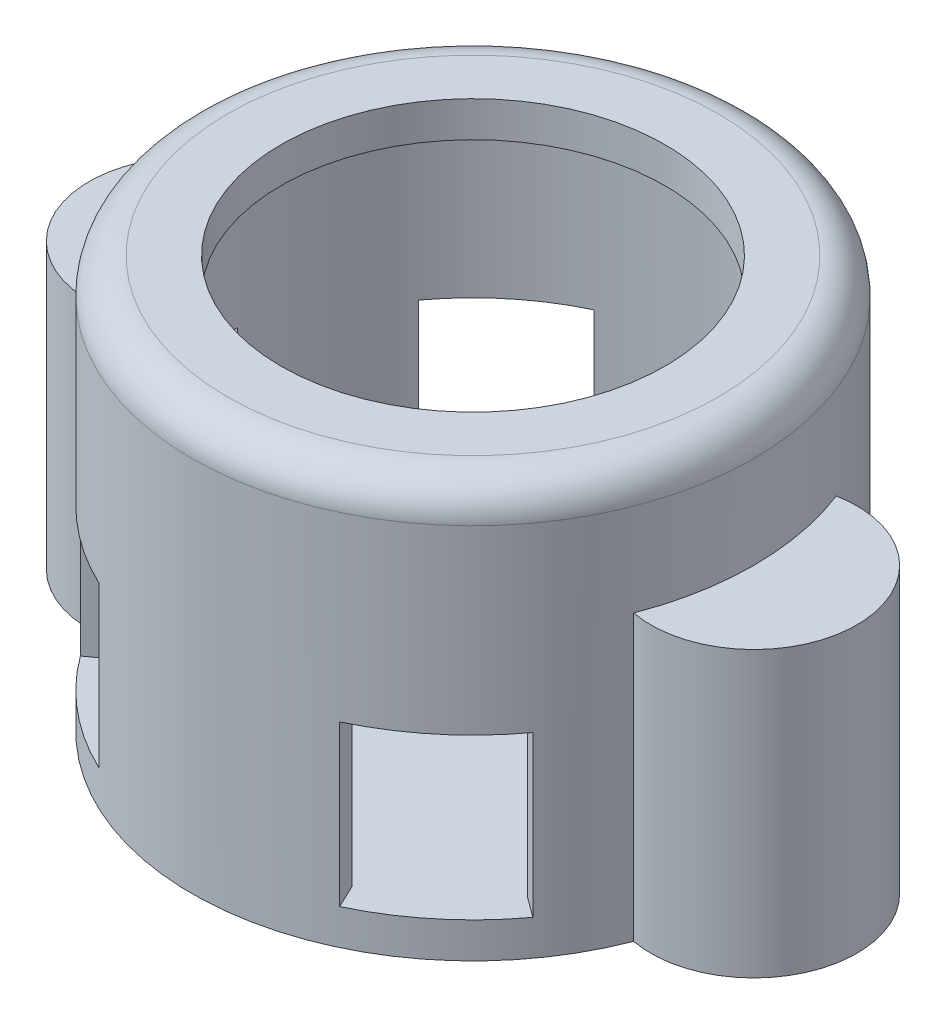
ISO-10303-21;
HEADER;
FILE_DESCRIPTION(('STEP AP214'),'2;1');
FILE_NAME('part.step','',(''),(''),'','','');
FILE_SCHEMA(('AUTOMOTIVE_DESIGN { 1 0 10303 214 1 1 1 1 }'));
ENDSEC;
DATA;
#1=APPLICATION_CONTEXT('core data for automotive mechanical design processes');
#2=APPLICATION_PROTOCOL_DEFINITION('international standard','automotive_design',2000,#1);
#3=PRODUCT_CONTEXT('',#1,'mechanical');
#4=PRODUCT('Part','Part','',(#3));
#5=PRODUCT_RELATED_PRODUCT_CATEGORY('part','',(#4));
#6=PRODUCT_DEFINITION_FORMATION('','',#4);
#7=PRODUCT_DEFINITION_CONTEXT('part definition',#1,'design');
#8=PRODUCT_DEFINITION('design','',#6,#7);
#9=PRODUCT_DEFINITION_SHAPE('','',#8);
#10=(LENGTH_UNIT() NAMED_UNIT(*) SI_UNIT(.MILLI.,.METRE.));
#11=(NAMED_UNIT(*) PLANE_ANGLE_UNIT() SI_UNIT($,.RADIAN.));
#12=(NAMED_UNIT(*) SI_UNIT($,.STERADIAN.) SOLID_ANGLE_UNIT());
#13=UNCERTAINTY_MEASURE_WITH_UNIT(LENGTH_MEASURE(1.E-05),#10,'distance_accuracy_value','');
#14=(GEOMETRIC_REPRESENTATION_CONTEXT(3) GLOBAL_UNCERTAINTY_ASSIGNED_CONTEXT((#13)) GLOBAL_UNIT_ASSIGNED_CONTEXT((#10,
#11,#12)) REPRESENTATION_CONTEXT('',''));
#15=CARTESIAN_POINT('',(0.,0.,0.));
#16=DIRECTION('',(0.,0.,1.));
#17=DIRECTION('',(1.,0.,0.));
#18=AXIS2_PLACEMENT_3D('',#15,#16,#17);
#19=CARTESIAN_POINT('',(0.,11.6,0.));
#20=DIRECTION('',(0.,-1.,0.));
#21=DIRECTION('',(0.,0.,-1.));
#22=AXIS2_PLACEMENT_3D('',#19,#20,#21);
#23=CYLINDRICAL_SURFACE('',#22,7.9);
#24=CARTESIAN_POINT('',(0.,5.5,0.));
#25=DIRECTION('',(0.,-1.,0.));
#26=DIRECTION('',(-0.805612655828306,0.,0.592442612215955));
#27=AXIS2_PLACEMENT_3D('',#24,#25,#26);
#28=CIRCLE('',#27,7.9);
#29=CARTESIAN_POINT('',(-3.38662025263003,5.5,7.13728262467419));
#30=VERTEX_POINT('',#29);
#31=CARTESIAN_POINT('',(-6.36433998104362,5.5,4.68029663650604));
#32=VERTEX_POINT('',#31);
#33=EDGE_CURVE('E497',#30,#32,#28,.T.);
#34=ORIENTED_EDGE('',*,*,#33,.F.);
#35=DIRECTION('',(0.,1.,0.));
#36=VECTOR('',#35,1.);
#37=CARTESIAN_POINT('',(-3.38662025263003,0.999999999999997,7.13728262467419));
#38=LINE('',#37,#36);
#39=CARTESIAN_POINT('',(-3.38662025263003,0.999999999999997,7.13728262467419));
#40=VERTEX_POINT('',#39);
#41=EDGE_CURVE('E508',#40,#30,#38,.T.);
#42=ORIENTED_EDGE('',*,*,#41,.F.);
#43=CARTESIAN_POINT('',(0.,0.999999999999999,0.));
#44=DIRECTION('',(0.,-1.,0.));
#45=DIRECTION('',(-0.805612655828306,0.,0.592442612215955));
#46=AXIS2_PLACEMENT_3D('',#43,#44,#45);
#47=CIRCLE('',#46,7.9);
#48=CARTESIAN_POINT('',(-6.36433998104362,0.999999999999999,4.68029663650604));
#49=VERTEX_POINT('',#48);
#50=EDGE_CURVE('E504',#40,#49,#47,.T.);
#51=ORIENTED_EDGE('',*,*,#50,.T.);
#52=DIRECTION('',(0.,-1.,0.));
#53=VECTOR('',#52,1.);
#54=CARTESIAN_POINT('',(-6.36433998104362,5.5,4.68029663650604));
#55=LINE('',#54,#53);
#56=EDGE_CURVE('E477',#32,#49,#55,.T.);
#57=ORIENTED_EDGE('',*,*,#56,.F.);
#58=EDGE_LOOP('',(#34,#42,#51,#57));
#59=FACE_BOUND('',#58,.T.);
#60=CARTESIAN_POINT('',(0.,0.999999999999999,0.));
#61=DIRECTION('',(0.,-1.,0.));
#62=DIRECTION('',(0.428686107927853,0.,0.903453496794201));
#63=AXIS2_PLACEMENT_3D('',#60,#61,#62);
#64=CIRCLE('',#63,7.9);
#65=CARTESIAN_POINT('',(6.36433998104361,0.999999999999999,4.68029663650605));
#66=VERTEX_POINT('',#65);
#67=CARTESIAN_POINT('',(3.38662025263004,0.999999999999997,7.13728262467419));
#68=VERTEX_POINT('',#67);
#69=EDGE_CURVE('E474',#66,#68,#64,.T.);
#70=ORIENTED_EDGE('',*,*,#69,.T.);
#71=DIRECTION('',(0.,-1.,0.));
#72=VECTOR('',#71,1.);
#73=CARTESIAN_POINT('',(3.38662025263004,5.5,7.13728262467419));
#74=LINE('',#73,#72);
#75=CARTESIAN_POINT('',(3.38662025263004,5.5,7.13728262467419));
#76=VERTEX_POINT('',#75);
#77=EDGE_CURVE('E487',#76,#68,#74,.T.);
#78=ORIENTED_EDGE('',*,*,#77,.F.);
#79=CARTESIAN_POINT('',(0.,5.5,0.));
#80=DIRECTION('',(0.,-1.,0.));
#81=DIRECTION('',(0.428686107927853,0.,0.903453496794201));
#82=AXIS2_PLACEMENT_3D('',#79,#80,#81);
#83=CIRCLE('',#82,7.9);
#84=CARTESIAN_POINT('',(6.36433998104361,5.5,4.68029663650605));
#85=VERTEX_POINT('',#84);
#86=EDGE_CURVE('E483',#85,#76,#83,.T.);
#87=ORIENTED_EDGE('',*,*,#86,.F.);
#88=DIRECTION('',(0.,1.,0.));
#89=VECTOR('',#88,1.);
#90=CARTESIAN_POINT('',(6.36433998104361,0.999999999999997,4.68029663650605));
#91=LINE('',#90,#89);
#92=EDGE_CURVE('E365',#66,#85,#91,.T.);
#93=ORIENTED_EDGE('',*,*,#92,.F.);
#94=EDGE_LOOP('',(#70,#78,#87,#93));
#95=FACE_BOUND('',#94,.T.);
#96=CARTESIAN_POINT('',(0.,5.5,0.));
#97=DIRECTION('',(0.,-1.,0.));
#98=DIRECTION('',(0.805612655828305,0.,-0.592442612215955));
#99=AXIS2_PLACEMENT_3D('',#96,#97,#98);
#100=CIRCLE('',#99,7.9);
#101=CARTESIAN_POINT('',(3.38662025263003,5.5,-7.13728262467419));
#102=VERTEX_POINT('',#101);
#103=CARTESIAN_POINT('',(6.36433998104361,5.5,-4.68029663650605));
#104=VERTEX_POINT('',#103);
#105=EDGE_CURVE('E452',#102,#104,#100,.T.);
#106=ORIENTED_EDGE('',*,*,#105,.F.);
#107=DIRECTION('',(0.,1.,0.));
#108=VECTOR('',#107,1.);
#109=CARTESIAN_POINT('',(3.38662025263004,1.,-7.13728262467419));
#110=LINE('',#109,#108);
#111=CARTESIAN_POINT('',(3.38662025263004,1.,-7.13728262467419));
#112=VERTEX_POINT('',#111);
#113=EDGE_CURVE('E463',#112,#102,#110,.T.);
#114=ORIENTED_EDGE('',*,*,#113,.F.);
#115=CARTESIAN_POINT('',(0.,1.,0.));
#116=DIRECTION('',(0.,-1.,0.));
#117=DIRECTION('',(0.805612655828305,0.,-0.592442612215955));
#118=AXIS2_PLACEMENT_3D('',#115,#116,#117);
#119=CIRCLE('',#118,7.9);
#120=CARTESIAN_POINT('',(6.36433998104361,1.,-4.68029663650605));
#121=VERTEX_POINT('',#120);
#122=EDGE_CURVE('E459',#112,#121,#119,.T.);
#123=ORIENTED_EDGE('',*,*,#122,.T.);
#124=DIRECTION('',(0.,-1.,0.));
#125=VECTOR('',#124,1.);
#126=CARTESIAN_POINT('',(6.36433998104361,5.5,-4.68029663650605));
#127=LINE('',#126,#125);
#128=EDGE_CURVE('E430',#104,#121,#127,.T.);
#129=ORIENTED_EDGE('',*,*,#128,.F.);
#130=EDGE_LOOP('',(#106,#114,#123,#129));
#131=FACE_BOUND('',#130,.T.);
#132=CARTESIAN_POINT('',(0.,1.,0.));
#133=DIRECTION('',(0.,-1.,0.));
#134=DIRECTION('',(-0.428686107927852,0.,-0.903453496794201));
#135=AXIS2_PLACEMENT_3D('',#132,#133,#134);
#136=CIRCLE('',#135,7.9);
#137=CARTESIAN_POINT('',(-6.36433998104361,1.,-4.68029663650605));
#138=VERTEX_POINT('',#137);
#139=CARTESIAN_POINT('',(-3.38662025263003,1.,-7.13728262467419));
#140=VERTEX_POINT('',#139);
#141=EDGE_CURVE('E427',#138,#140,#136,.T.);
#142=ORIENTED_EDGE('',*,*,#141,.T.);
#143=DIRECTION('',(0.,-1.,0.));
#144=VECTOR('',#143,1.);
#145=CARTESIAN_POINT('',(-3.38662025263003,5.5,-7.13728262467419));
#146=LINE('',#145,#144);
#147=CARTESIAN_POINT('',(-3.38662025263003,5.5,-7.13728262467419));
#148=VERTEX_POINT('',#147);
#149=EDGE_CURVE('E442',#148,#140,#146,.T.);
#150=ORIENTED_EDGE('',*,*,#149,.F.);
#151=CARTESIAN_POINT('',(0.,5.5,0.));
#152=DIRECTION('',(0.,-1.,0.));
#153=DIRECTION('',(-0.428686107927852,0.,-0.903453496794201));
#154=AXIS2_PLACEMENT_3D('',#151,#152,#153);
#155=CIRCLE('',#154,7.9);
#156=CARTESIAN_POINT('',(-6.36433998104361,5.5,-4.68029663650605));
#157=VERTEX_POINT('',#156);
#158=EDGE_CURVE('E437',#157,#148,#155,.T.);
#159=ORIENTED_EDGE('',*,*,#158,.F.);
#160=DIRECTION('',(0.,1.,0.));
#161=VECTOR('',#160,1.);
#162=CARTESIAN_POINT('',(-6.36433998104361,1.,-4.68029663650605));
#163=LINE('',#162,#161);
#164=EDGE_CURVE('E434',#138,#157,#163,.T.);
#165=ORIENTED_EDGE('',*,*,#164,.F.);
#166=EDGE_LOOP('',(#142,#150,#159,#165));
#167=FACE_BOUND('',#166,.T.);
#168=CARTESIAN_POINT('',(0.,10.6,0.));
#169=DIRECTION('',(0.,1.,0.));
#170=DIRECTION('',(0.,0.,1.));
#171=AXIS2_PLACEMENT_3D('',#168,#169,#170);
#172=CIRCLE('',#171,7.9);
#173=CARTESIAN_POINT('',(0.,10.6,7.9));
#174=VERTEX_POINT('',#173);
#175=EDGE_CURVE('E929',#174,#174,#172,.F.);
#176=ORIENTED_EDGE('',*,*,#175,.T.);
#177=EDGE_LOOP('',(#176));
#178=FACE_BOUND('',#177,.T.);
#179=DIRECTION('',(0.,-1.,0.));
#180=VECTOR('',#179,1.);
#181=CARTESIAN_POINT('',(7.36772151898734,8.,2.85073317212447));
#182=LINE('',#181,#180);
#183=CARTESIAN_POINT('',(7.36772151898734,8.,2.85073317212447));
#184=VERTEX_POINT('',#183);
#185=CARTESIAN_POINT('',(7.36772151898734,0.,2.85073317212447));
#186=VERTEX_POINT('',#185);
#187=EDGE_CURVE('E403',#184,#186,#182,.T.);
#188=ORIENTED_EDGE('',*,*,#187,.F.);
#189=CARTESIAN_POINT('',(0.,8.,0.));
#190=DIRECTION('',(0.,1.,0.));
#191=DIRECTION('',(0.,0.,1.));
#192=AXIS2_PLACEMENT_3D('',#189,#190,#191);
#193=CIRCLE('',#192,7.9);
#194=CARTESIAN_POINT('',(7.36772151898734,8.,-2.85073317212447));
#195=VERTEX_POINT('',#194);
#196=EDGE_CURVE('E405',#184,#195,#193,.T.);
#197=ORIENTED_EDGE('',*,*,#196,.T.);
#198=DIRECTION('',(0.,-1.,0.));
#199=VECTOR('',#198,1.);
#200=CARTESIAN_POINT('',(7.36772151898734,8.,-2.85073317212447));
#201=LINE('',#200,#199);
#202=CARTESIAN_POINT('',(7.36772151898734,0.,-2.85073317212447));
#203=VERTEX_POINT('',#202);
#204=EDGE_CURVE('E397',#195,#203,#201,.T.);
#205=ORIENTED_EDGE('',*,*,#204,.T.);
#206=CARTESIAN_POINT('',(0.,0.,0.));
#207=DIRECTION('',(0.,1.,0.));
#208=DIRECTION('',(0.,0.,1.));
#209=AXIS2_PLACEMENT_3D('',#206,#207,#208);
#210=CIRCLE('',#209,7.9);
#211=CARTESIAN_POINT('',(-7.36772151898734,0.,-2.85073317212447));
#212=VERTEX_POINT('',#211);
#213=EDGE_CURVE('E382',#203,#212,#210,.T.);
#214=ORIENTED_EDGE('',*,*,#213,.T.);
#215=DIRECTION('',(0.,-1.,0.));
#216=VECTOR('',#215,1.);
#217=CARTESIAN_POINT('',(-7.36772151898734,8.,-2.85073317212447));
#218=LINE('',#217,#216);
#219=CARTESIAN_POINT('',(-7.36772151898734,8.,-2.85073317212447));
#220=VERTEX_POINT('',#219);
#221=EDGE_CURVE('E386',#220,#212,#218,.T.);
#222=ORIENTED_EDGE('',*,*,#221,.F.);
#223=CARTESIAN_POINT('',(0.,8.,0.));
#224=DIRECTION('',(0.,1.,0.));
#225=DIRECTION('',(0.,0.,1.));
#226=AXIS2_PLACEMENT_3D('',#223,#224,#225);
#227=CIRCLE('',#226,7.9);
#228=CARTESIAN_POINT('',(-7.36772151898734,8.,2.85073317212447));
#229=VERTEX_POINT('',#228);
#230=EDGE_CURVE('E396',#220,#229,#227,.T.);
#231=ORIENTED_EDGE('',*,*,#230,.T.);
#232=DIRECTION('',(0.,-1.,0.));
#233=VECTOR('',#232,1.);
#234=CARTESIAN_POINT('',(-7.36772151898734,8.,2.85073317212447));
#235=LINE('',#234,#233);
#236=CARTESIAN_POINT('',(-7.36772151898734,0.,2.85073317212447));
#237=VERTEX_POINT('',#236);
#238=EDGE_CURVE('E390',#229,#237,#235,.T.);
#239=ORIENTED_EDGE('',*,*,#238,.T.);
#240=EDGE_CURVE('E379',#237,#186,#210,.T.);
#241=ORIENTED_EDGE('',*,*,#240,.T.);
#242=EDGE_LOOP('',(#188,#197,#205,#214,#222,#231,#239,#241));
#243=FACE_BOUND('',#242,.T.);
#244=ADVANCED_FACE('F164',(#59,#95,#131,#167,#178,#243),#23,.T.);
#245=CARTESIAN_POINT('',(0.,11.6,0.));
#246=DIRECTION('',(0.,1.,0.));
#247=DIRECTION('',(0.,0.,1.));
#248=AXIS2_PLACEMENT_3D('',#245,#246,#247);
#249=PLANE('',#248);
#250=CARTESIAN_POINT('',(0.,11.6,0.));
#251=DIRECTION('',(0.,1.,0.));
#252=DIRECTION('',(0.,0.,1.));
#253=AXIS2_PLACEMENT_3D('',#250,#251,#252);
#254=CIRCLE('',#253,6.9);
#255=CARTESIAN_POINT('',(0.,11.6,6.9));
#256=VERTEX_POINT('',#255);
#257=EDGE_CURVE('E931',#256,#256,#254,.T.);
#258=ORIENTED_EDGE('',*,*,#257,.T.);
#259=EDGE_LOOP('',(#258));
#260=FACE_BOUND('',#259,.T.);
#261=CARTESIAN_POINT('',(0.,11.6,0.));
#262=DIRECTION('',(0.,1.,0.));
#263=DIRECTION('',(0.,0.,1.));
#264=AXIS2_PLACEMENT_3D('',#261,#262,#263);
#265=CIRCLE('',#264,5.4);
#266=CARTESIAN_POINT('',(0.,11.6,5.4));
#267=VERTEX_POINT('',#266);
#268=EDGE_CURVE('E417',#267,#267,#265,.T.);
#269=ORIENTED_EDGE('',*,*,#268,.F.);
#270=EDGE_LOOP('',(#269));
#271=FACE_BOUND('',#270,.T.);
#272=ADVANCED_FACE('F527',(#260,#271),#249,.T.);
#273=CARTESIAN_POINT('',(0.,0.,0.));
#274=DIRECTION('',(0.,1.,0.));
#275=DIRECTION('',(0.,0.,1.));
#276=AXIS2_PLACEMENT_3D('',#273,#274,#275);
#277=PLANE('',#276);
#278=CARTESIAN_POINT('',(-8.,0.,0.));
#279=DIRECTION('',(0.,-1.,0.));
#280=DIRECTION('',(0.,0.,-1.));
#281=AXIS2_PLACEMENT_3D('',#278,#279,#280);
#282=CIRCLE('',#281,1.);
#283=CARTESIAN_POINT('',(-8.,0.,-1.));
#284=VERTEX_POINT('',#283);
#285=EDGE_CURVE('E518',#284,#284,#282,.T.);
#286=ORIENTED_EDGE('',*,*,#285,.F.);
#287=EDGE_LOOP('',(#286));
#288=FACE_BOUND('',#287,.T.);
#289=CARTESIAN_POINT('',(8.,0.,0.));
#290=DIRECTION('',(0.,-1.,0.));
#291=DIRECTION('',(0.,0.,-1.));
#292=AXIS2_PLACEMENT_3D('',#289,#290,#291);
#293=CIRCLE('',#292,1.);
#294=CARTESIAN_POINT('',(8.,0.,-1.));
#295=VERTEX_POINT('',#294);
#296=EDGE_CURVE('E335',#295,#295,#293,.T.);
#297=ORIENTED_EDGE('',*,*,#296,.F.);
#298=EDGE_LOOP('',(#297));
#299=FACE_BOUND('',#298,.T.);
#300=ORIENTED_EDGE('',*,*,#240,.F.);
#301=CARTESIAN_POINT('',(-7.9,0.,0.));
#302=DIRECTION('',(0.,1.,0.));
#303=DIRECTION('',(0.,0.,1.));
#304=AXIS2_PLACEMENT_3D('',#301,#302,#303);
#305=CIRCLE('',#304,2.9);
#306=EDGE_CURVE('E393',#212,#237,#305,.T.);
#307=ORIENTED_EDGE('',*,*,#306,.F.);
#308=ORIENTED_EDGE('',*,*,#213,.F.);
#309=CARTESIAN_POINT('',(7.9,0.,0.));
#310=DIRECTION('',(0.,1.,0.));
#311=DIRECTION('',(0.,0.,1.));
#312=AXIS2_PLACEMENT_3D('',#309,#310,#311);
#313=CIRCLE('',#312,2.9);
#314=EDGE_CURVE('E406',#186,#203,#313,.T.);
#315=ORIENTED_EDGE('',*,*,#314,.F.);
#316=EDGE_LOOP('',(#300,#307,#308,#315));
#317=FACE_BOUND('',#316,.T.);
#318=ADVANCED_FACE('F523',(#288,#299,#317),#277,.F.);
#319=CARTESIAN_POINT('',(-7.9,8.,0.));
#320=DIRECTION('',(0.,-1.,0.));
#321=DIRECTION('',(0.,0.,-1.));
#322=AXIS2_PLACEMENT_3D('',#319,#320,#321);
#323=CYLINDRICAL_SURFACE('',#322,2.9);
#324=ORIENTED_EDGE('',*,*,#306,.T.);
#325=ORIENTED_EDGE('',*,*,#238,.F.);
#326=CARTESIAN_POINT('',(-7.9,8.,0.));
#327=DIRECTION('',(0.,1.,0.));
#328=DIRECTION('',(0.,0.,1.));
#329=AXIS2_PLACEMENT_3D('',#326,#327,#328);
#330=CIRCLE('',#329,2.9);
#331=EDGE_CURVE('E392',#220,#229,#330,.T.);
#332=ORIENTED_EDGE('',*,*,#331,.F.);
#333=ORIENTED_EDGE('',*,*,#221,.T.);
#334=EDGE_LOOP('',(#324,#325,#332,#333));
#335=FACE_BOUND('',#334,.T.);
#336=ADVANCED_FACE('F526',(#335),#323,.T.);
#337=CARTESIAN_POINT('',(0.,8.,0.));
#338=DIRECTION('',(0.,1.,0.));
#339=DIRECTION('',(0.,0.,1.));
#340=AXIS2_PLACEMENT_3D('',#337,#338,#339);
#341=PLANE('',#340);
#342=ORIENTED_EDGE('',*,*,#230,.F.);
#343=ORIENTED_EDGE('',*,*,#331,.T.);
#344=EDGE_LOOP('',(#342,#343));
#345=FACE_BOUND('',#344,.T.);
#346=ADVANCED_FACE('F554',(#345),#341,.T.);
#347=CARTESIAN_POINT('',(7.9,8.,0.));
#348=DIRECTION('',(0.,-1.,0.));
#349=DIRECTION('',(0.,0.,-1.));
#350=AXIS2_PLACEMENT_3D('',#347,#348,#349);
#351=CYLINDRICAL_SURFACE('',#350,2.9);
#352=ORIENTED_EDGE('',*,*,#314,.T.);
#353=ORIENTED_EDGE('',*,*,#204,.F.);
#354=CARTESIAN_POINT('',(7.9,8.,0.));
#355=DIRECTION('',(0.,1.,0.));
#356=DIRECTION('',(0.,0.,1.));
#357=AXIS2_PLACEMENT_3D('',#354,#355,#356);
#358=CIRCLE('',#357,2.9);
#359=EDGE_CURVE('E409',#184,#195,#358,.T.);
#360=ORIENTED_EDGE('',*,*,#359,.F.);
#361=ORIENTED_EDGE('',*,*,#187,.T.);
#362=EDGE_LOOP('',(#352,#353,#360,#361));
#363=FACE_BOUND('',#362,.T.);
#364=ADVANCED_FACE('F541',(#363),#351,.T.);
#365=CARTESIAN_POINT('',(0.,8.,0.));
#366=DIRECTION('',(0.,1.,0.));
#367=DIRECTION('',(0.,0.,1.));
#368=AXIS2_PLACEMENT_3D('',#365,#366,#367);
#369=PLANE('',#368);
#370=ORIENTED_EDGE('',*,*,#359,.T.);
#371=ORIENTED_EDGE('',*,*,#196,.F.);
#372=EDGE_LOOP('',(#370,#371));
#373=FACE_BOUND('',#372,.T.);
#374=ADVANCED_FACE('F543',(#373),#369,.T.);
#375=CARTESIAN_POINT('',(0.,10.6,0.));
#376=DIRECTION('',(0.,1.,0.));
#377=DIRECTION('',(0.,0.,1.));
#378=AXIS2_PLACEMENT_3D('',#375,#376,#377);
#379=PLANE('',#378);
#380=CARTESIAN_POINT('',(0.,10.6,0.));
#381=DIRECTION('',(0.,1.,0.));
#382=DIRECTION('',(0.,0.,1.));
#383=AXIS2_PLACEMENT_3D('',#380,#381,#382);
#384=CIRCLE('',#383,5.4);
#385=CARTESIAN_POINT('',(0.,10.6,5.4));
#386=VERTEX_POINT('',#385);
#387=EDGE_CURVE('E416',#386,#386,#384,.T.);
#388=ORIENTED_EDGE('',*,*,#387,.T.);
#389=EDGE_LOOP('',(#388));
#390=FACE_BOUND('',#389,.T.);
#391=CARTESIAN_POINT('',(0.,10.6,0.));
#392=DIRECTION('',(0.,1.,0.));
#393=DIRECTION('',(0.,0.,1.));
#394=AXIS2_PLACEMENT_3D('',#391,#392,#393);
#395=CIRCLE('',#394,7.16746803387519);
#396=CARTESIAN_POINT('',(0.,10.6,7.16746803387519));
#397=VERTEX_POINT('',#396);
#398=EDGE_CURVE('E410',#397,#397,#395,.T.);
#399=ORIENTED_EDGE('',*,*,#398,.F.);
#400=EDGE_LOOP('',(#399));
#401=FACE_BOUND('',#400,.T.);
#402=ADVANCED_FACE('F545',(#390,#401),#379,.F.);
#403=CARTESIAN_POINT('',(0.,10.6,0.));
#404=DIRECTION('',(0.,1.,0.));
#405=DIRECTION('',(0.,0.,1.));
#406=AXIS2_PLACEMENT_3D('',#403,#404,#405);
#407=CYLINDRICAL_SURFACE('',#406,5.4);
#408=ORIENTED_EDGE('',*,*,#387,.F.);
#409=EDGE_LOOP('',(#408));
#410=FACE_BOUND('',#409,.T.);
#411=ORIENTED_EDGE('',*,*,#268,.T.);
#412=EDGE_LOOP('',(#411));
#413=FACE_BOUND('',#412,.T.);
#414=ADVANCED_FACE('F551',(#410,#413),#407,.F.);
#415=CARTESIAN_POINT('',(0.,1.,0.));
#416=DIRECTION('',(0.,1.,0.));
#417=DIRECTION('',(0.,0.,1.));
#418=AXIS2_PLACEMENT_3D('',#415,#416,#417);
#419=PLANE('',#418);
#420=CARTESIAN_POINT('',(-8.,1.,0.));
#421=DIRECTION('',(0.,1.,0.));
#422=DIRECTION('',(0.,0.,1.));
#423=AXIS2_PLACEMENT_3D('',#420,#421,#422);
#424=CIRCLE('',#423,1.);
#425=CARTESIAN_POINT('',(-7.14828737603892,1.,0.524009166127202));
#426=VERTEX_POINT('',#425);
#427=CARTESIAN_POINT('',(-7.14828737603891,1.,-0.524009166127203));
#428=VERTEX_POINT('',#427);
#429=EDGE_CURVE('E354',#426,#428,#424,.T.);
#430=ORIENTED_EDGE('',*,*,#429,.F.);
#431=CARTESIAN_POINT('',(0.,1.,0.));
#432=DIRECTION('',(0.,1.,0.));
#433=DIRECTION('',(0.,0.,1.));
#434=AXIS2_PLACEMENT_3D('',#431,#432,#433);
#435=CIRCLE('',#434,7.16746803387519);
#436=CARTESIAN_POINT('',(-5.77420295833467,0.999999999999999,4.24631348496337));
#437=VERTEX_POINT('',#436);
#438=EDGE_CURVE('E360',#426,#437,#435,.T.);
#439=ORIENTED_EDGE('',*,*,#438,.T.);
#440=DIRECTION('',(-0.805612655828306,0.,0.592442612215955));
#441=VECTOR('',#440,1.);
#442=CARTESIAN_POINT('',(-6.36433998104362,0.999999999999999,4.68029663650604));
#443=LINE('',#442,#441);
#444=EDGE_CURVE('E494',#437,#49,#443,.T.);
#445=ORIENTED_EDGE('',*,*,#444,.T.);
#446=ORIENTED_EDGE('',*,*,#50,.F.);
#447=DIRECTION('',(-0.428686107927852,0.,0.903453496794201));
#448=VECTOR('',#447,1.);
#449=CARTESIAN_POINT('',(-3.38662025263003,0.999999999999997,7.13728262467419));
#450=LINE('',#449,#448);
#451=CARTESIAN_POINT('',(-3.07259397513925,1.,6.4754740583652));
#452=VERTEX_POINT('',#451);
#453=EDGE_CURVE('E438',#452,#40,#450,.T.);
#454=ORIENTED_EDGE('',*,*,#453,.F.);
#455=CARTESIAN_POINT('',(3.07259397513926,0.999999999999999,6.47547405836519));
#456=VERTEX_POINT('',#455);
#457=EDGE_CURVE('E371',#452,#456,#435,.T.);
#458=ORIENTED_EDGE('',*,*,#457,.T.);
#459=DIRECTION('',(0.428686107927853,0.,0.903453496794201));
#460=VECTOR('',#459,1.);
#461=CARTESIAN_POINT('',(3.38662025263004,0.999999999999997,7.13728262467419));
#462=LINE('',#461,#460);
#463=EDGE_CURVE('E478',#456,#68,#462,.T.);
#464=ORIENTED_EDGE('',*,*,#463,.T.);
#465=ORIENTED_EDGE('',*,*,#69,.F.);
#466=DIRECTION('',(0.805612655828305,0.,0.592442612215955));
#467=VECTOR('',#466,1.);
#468=CARTESIAN_POINT('',(6.36433998104361,0.999999999999999,4.68029663650605));
#469=LINE('',#468,#467);
#470=CARTESIAN_POINT('',(5.77420295833467,0.999999999999999,4.24631348496337));
#471=VERTEX_POINT('',#470);
#472=EDGE_CURVE('E473',#471,#66,#469,.T.);
#473=ORIENTED_EDGE('',*,*,#472,.F.);
#474=CARTESIAN_POINT('',(7.14828737603891,1.,0.524009166127203));
#475=VERTEX_POINT('',#474);
#476=EDGE_CURVE('E373',#471,#475,#435,.T.);
#477=ORIENTED_EDGE('',*,*,#476,.T.);
#478=CARTESIAN_POINT('',(8.,1.,0.));
#479=DIRECTION('',(0.,1.,0.));
#480=DIRECTION('',(0.,0.,1.));
#481=AXIS2_PLACEMENT_3D('',#478,#479,#480);
#482=CIRCLE('',#481,1.);
#483=CARTESIAN_POINT('',(7.14828737603892,1.,-0.524009166127203));
#484=VERTEX_POINT('',#483);
#485=EDGE_CURVE('E366',#484,#475,#482,.T.);
#486=ORIENTED_EDGE('',*,*,#485,.F.);
#487=CARTESIAN_POINT('',(5.77420295833467,1.,-4.24631348496337));
#488=VERTEX_POINT('',#487);
#489=EDGE_CURVE('E342',#484,#488,#435,.T.);
#490=ORIENTED_EDGE('',*,*,#489,.T.);
#491=DIRECTION('',(0.805612655828305,0.,-0.592442612215955));
#492=VECTOR('',#491,1.);
#493=CARTESIAN_POINT('',(6.36433998104361,1.,-4.68029663650605));
#494=LINE('',#493,#492);
#495=EDGE_CURVE('E449',#488,#121,#494,.T.);
#496=ORIENTED_EDGE('',*,*,#495,.T.);
#497=ORIENTED_EDGE('',*,*,#122,.F.);
#498=DIRECTION('',(0.428686107927853,0.,-0.903453496794201));
#499=VECTOR('',#498,1.);
#500=CARTESIAN_POINT('',(3.38662025263004,1.,-7.13728262467419));
#501=LINE('',#500,#499);
#502=CARTESIAN_POINT('',(3.07259397513925,1.,-6.4754740583652));
#503=VERTEX_POINT('',#502);
#504=EDGE_CURVE('E420',#503,#112,#501,.T.);
#505=ORIENTED_EDGE('',*,*,#504,.F.);
#506=CARTESIAN_POINT('',(-3.07259397513925,1.,-6.4754740583652));
#507=VERTEX_POINT('',#506);
#508=EDGE_CURVE('E374',#503,#507,#435,.T.);
#509=ORIENTED_EDGE('',*,*,#508,.T.);
#510=DIRECTION('',(-0.428686107927852,0.,-0.903453496794201));
#511=VECTOR('',#510,1.);
#512=CARTESIAN_POINT('',(-3.38662025263003,1.,-7.13728262467419));
#513=LINE('',#512,#511);
#514=EDGE_CURVE('E431',#507,#140,#513,.T.);
#515=ORIENTED_EDGE('',*,*,#514,.T.);
#516=ORIENTED_EDGE('',*,*,#141,.F.);
#517=DIRECTION('',(-0.805612655828305,0.,-0.592442612215955));
#518=VECTOR('',#517,1.);
#519=CARTESIAN_POINT('',(-6.36433998104361,1.,-4.68029663650605));
#520=LINE('',#519,#518);
#521=CARTESIAN_POINT('',(-5.77420295833467,1.,-4.24631348496337));
#522=VERTEX_POINT('',#521);
#523=EDGE_CURVE('E426',#522,#138,#520,.T.);
#524=ORIENTED_EDGE('',*,*,#523,.F.);
#525=EDGE_CURVE('E364',#522,#428,#435,.T.);
#526=ORIENTED_EDGE('',*,*,#525,.T.);
#527=EDGE_LOOP('',(#430,#439,#445,#446,#454,#458,#464,#465,#473,#477,#486,#490,#496,#497,#505,
#509,#515,#516,#524,#526));
#528=FACE_BOUND('',#527,.T.);
#529=ADVANCED_FACE('F358',(#528),#419,.T.);
#530=CARTESIAN_POINT('',(0.,11.6,0.));
#531=DIRECTION('',(0.,-1.,0.));
#532=DIRECTION('',(0.,0.,-1.));
#533=AXIS2_PLACEMENT_3D('',#530,#531,#532);
#534=CYLINDRICAL_SURFACE('',#533,7.16746803387519);
#535=DIRECTION('',(0.,-1.,0.));
#536=VECTOR('',#535,1.);
#537=CARTESIAN_POINT('',(-7.14828737603892,3.,-0.524009166127202));
#538=LINE('',#537,#536);
#539=CARTESIAN_POINT('',(-7.14828737603892,6.,-0.524009166127199));
#540=VERTEX_POINT('',#539);
#541=EDGE_CURVE('E13',#428,#540,#538,.F.);
#542=ORIENTED_EDGE('',*,*,#541,.F.);
#543=ORIENTED_EDGE('',*,*,#525,.F.);
#544=DIRECTION('',(0.,-1.,0.));
#545=VECTOR('',#544,1.);
#546=CARTESIAN_POINT('',(-5.77420295833467,11.6,-4.24631348496338));
#547=LINE('',#546,#545);
#548=CARTESIAN_POINT('',(-5.77420295833467,5.5,-4.24631348496337));
#549=VERTEX_POINT('',#548);
#550=EDGE_CURVE('E925',#549,#522,#547,.T.);
#551=ORIENTED_EDGE('',*,*,#550,.F.);
#552=CARTESIAN_POINT('',(0.,5.5,0.));
#553=DIRECTION('',(0.,1.,0.));
#554=DIRECTION('',(0.,0.,1.));
#555=AXIS2_PLACEMENT_3D('',#552,#553,#554);
#556=CIRCLE('',#555,7.16746803387519);
#557=CARTESIAN_POINT('',(-3.07259397513925,5.5,-6.4754740583652));
#558=VERTEX_POINT('',#557);
#559=EDGE_CURVE('E927',#558,#549,#556,.T.);
#560=ORIENTED_EDGE('',*,*,#559,.F.);
#561=DIRECTION('',(0.,-1.,0.));
#562=VECTOR('',#561,1.);
#563=CARTESIAN_POINT('',(-3.07259397513925,11.6,-6.4754740583652));
#564=LINE('',#563,#562);
#565=EDGE_CURVE('E922',#507,#558,#564,.F.);
#566=ORIENTED_EDGE('',*,*,#565,.F.);
#567=ORIENTED_EDGE('',*,*,#508,.F.);
#568=DIRECTION('',(0.,-1.,0.));
#569=VECTOR('',#568,1.);
#570=CARTESIAN_POINT('',(3.07259397513925,11.6,-6.4754740583652));
#571=LINE('',#570,#569);
#572=CARTESIAN_POINT('',(3.07259397513925,5.5,-6.4754740583652));
#573=VERTEX_POINT('',#572);
#574=EDGE_CURVE('E915',#573,#503,#571,.T.);
#575=ORIENTED_EDGE('',*,*,#574,.F.);
#576=CARTESIAN_POINT('',(0.,5.5,0.));
#577=DIRECTION('',(0.,1.,0.));
#578=DIRECTION('',(0.,0.,1.));
#579=AXIS2_PLACEMENT_3D('',#576,#577,#578);
#580=CIRCLE('',#579,7.16746803387519);
#581=CARTESIAN_POINT('',(5.77420295833467,5.5,-4.24631348496337));
#582=VERTEX_POINT('',#581);
#583=EDGE_CURVE('E918',#582,#573,#580,.T.);
#584=ORIENTED_EDGE('',*,*,#583,.F.);
#585=DIRECTION('',(0.,-1.,0.));
#586=VECTOR('',#585,1.);
#587=CARTESIAN_POINT('',(5.77420295833467,11.6,-4.24631348496337));
#588=LINE('',#587,#586);
#589=EDGE_CURVE('E920',#488,#582,#588,.F.);
#590=ORIENTED_EDGE('',*,*,#589,.F.);
#591=ORIENTED_EDGE('',*,*,#489,.F.);
#592=DIRECTION('',(0.,-1.,0.));
#593=VECTOR('',#592,1.);
#594=CARTESIAN_POINT('',(7.14828737603892,3.,-0.524009166127203));
#595=LINE('',#594,#593);
#596=CARTESIAN_POINT('',(7.14828737603892,6.,-0.524009166127202));
#597=VERTEX_POINT('',#596);
#598=EDGE_CURVE('E327',#597,#484,#595,.T.);
#599=ORIENTED_EDGE('',*,*,#598,.F.);
#600=CARTESIAN_POINT('',(0.,6.,0.));
#601=DIRECTION('',(0.,-1.,0.));
#602=DIRECTION('',(0.,0.,-1.));
#603=AXIS2_PLACEMENT_3D('',#600,#601,#602);
#604=CIRCLE('',#603,7.16746803387519);
#605=CARTESIAN_POINT('',(7.14828737603892,6.,0.524009166127202));
#606=VERTEX_POINT('',#605);
#607=EDGE_CURVE('E322',#597,#606,#604,.T.);
#608=ORIENTED_EDGE('',*,*,#607,.T.);
#609=DIRECTION('',(0.,-1.,0.));
#610=VECTOR('',#609,1.);
#611=CARTESIAN_POINT('',(7.14828737603892,3.,0.524009166127203));
#612=LINE('',#611,#610);
#613=EDGE_CURVE('E334',#475,#606,#612,.F.);
#614=ORIENTED_EDGE('',*,*,#613,.F.);
#615=ORIENTED_EDGE('',*,*,#476,.F.);
#616=DIRECTION('',(0.,-1.,0.));
#617=VECTOR('',#616,1.);
#618=CARTESIAN_POINT('',(5.77420295833467,11.6,4.24631348496338));
#619=LINE('',#618,#617);
#620=CARTESIAN_POINT('',(5.77420295833467,5.5,4.24631348496337));
#621=VERTEX_POINT('',#620);
#622=EDGE_CURVE('E911',#621,#471,#619,.T.);
#623=ORIENTED_EDGE('',*,*,#622,.F.);
#624=CARTESIAN_POINT('',(0.,5.5,0.));
#625=DIRECTION('',(0.,1.,0.));
#626=DIRECTION('',(0.,0.,1.));
#627=AXIS2_PLACEMENT_3D('',#624,#625,#626);
#628=CIRCLE('',#627,7.16746803387519);
#629=CARTESIAN_POINT('',(3.07259397513926,5.5,6.47547405836519));
#630=VERTEX_POINT('',#629);
#631=EDGE_CURVE('E913',#630,#621,#628,.T.);
#632=ORIENTED_EDGE('',*,*,#631,.F.);
#633=DIRECTION('',(0.,-1.,0.));
#634=VECTOR('',#633,1.);
#635=CARTESIAN_POINT('',(3.07259397513926,11.6,6.47547405836519));
#636=LINE('',#635,#634);
#637=EDGE_CURVE('E900',#456,#630,#636,.F.);
#638=ORIENTED_EDGE('',*,*,#637,.F.);
#639=ORIENTED_EDGE('',*,*,#457,.F.);
#640=DIRECTION('',(0.,-1.,0.));
#641=VECTOR('',#640,1.);
#642=CARTESIAN_POINT('',(-3.07259397513925,11.6,6.4754740583652));
#643=LINE('',#642,#641);
#644=CARTESIAN_POINT('',(-3.07259397513925,5.5,6.4754740583652));
#645=VERTEX_POINT('',#644);
#646=EDGE_CURVE('E328',#645,#452,#643,.T.);
#647=ORIENTED_EDGE('',*,*,#646,.F.);
#648=CARTESIAN_POINT('',(0.,5.5,0.));
#649=DIRECTION('',(0.,1.,0.));
#650=DIRECTION('',(0.,0.,1.));
#651=AXIS2_PLACEMENT_3D('',#648,#649,#650);
#652=CIRCLE('',#651,7.16746803387519);
#653=CARTESIAN_POINT('',(-5.77420295833467,5.5,4.24631348496337));
#654=VERTEX_POINT('',#653);
#655=EDGE_CURVE('E899',#654,#645,#652,.T.);
#656=ORIENTED_EDGE('',*,*,#655,.F.);
#657=DIRECTION('',(0.,-1.,0.));
#658=VECTOR('',#657,1.);
#659=CARTESIAN_POINT('',(-5.77420295833467,11.6,4.24631348496337));
#660=LINE('',#659,#658);
#661=EDGE_CURVE('E370',#437,#654,#660,.F.);
#662=ORIENTED_EDGE('',*,*,#661,.F.);
#663=ORIENTED_EDGE('',*,*,#438,.F.);
#664=DIRECTION('',(0.,-1.,0.));
#665=VECTOR('',#664,1.);
#666=CARTESIAN_POINT('',(-7.14828737603892,3.,0.524009166127202));
#667=LINE('',#666,#665);
#668=CARTESIAN_POINT('',(-7.14828737603892,6.,0.524009166127199));
#669=VERTEX_POINT('',#668);
#670=EDGE_CURVE('E172',#669,#426,#667,.T.);
#671=ORIENTED_EDGE('',*,*,#670,.F.);
#672=CARTESIAN_POINT('',(0.,6.,0.));
#673=DIRECTION('',(0.,-1.,0.));
#674=DIRECTION('',(0.,0.,-1.));
#675=AXIS2_PLACEMENT_3D('',#672,#673,#674);
#676=CIRCLE('',#675,7.16746803387519);
#677=EDGE_CURVE('E344',#669,#540,#676,.T.);
#678=ORIENTED_EDGE('',*,*,#677,.T.);
#679=EDGE_LOOP('',(#542,#543,#551,#560,#566,#567,#575,#584,#590,#591,#599,#608,#614,#615,#623,
#632,#638,#639,#647,#656,#662,#663,#671,#678));
#680=FACE_BOUND('',#679,.T.);
#681=ORIENTED_EDGE('',*,*,#398,.T.);
#682=EDGE_LOOP('',(#681));
#683=FACE_BOUND('',#682,.T.);
#684=ADVANCED_FACE('F339',(#680,#683),#534,.F.);
#685=CARTESIAN_POINT('',(0.,10.6,0.));
#686=DIRECTION('',(0.,1.,0.));
#687=DIRECTION('',(0.,0.,1.));
#688=AXIS2_PLACEMENT_3D('',#685,#686,#687);
#689=TOROIDAL_SURFACE('',#688,6.9,1.);
#690=ORIENTED_EDGE('',*,*,#175,.F.);
#691=EDGE_LOOP('',(#690));
#692=FACE_BOUND('',#691,.T.);
#693=ORIENTED_EDGE('',*,*,#257,.F.);
#694=EDGE_LOOP('',(#693));
#695=FACE_BOUND('',#694,.T.);
#696=ADVANCED_FACE('F166',(#692,#695),#689,.T.);
#697=CARTESIAN_POINT('',(-3.38662025263003,3.25,-7.13728262467419));
#698=DIRECTION('',(0.903453496794201,0.,-0.428686107927852));
#699=DIRECTION('',(0.,-1.,0.));
#700=AXIS2_PLACEMENT_3D('',#697,#698,#699);
#701=PLANE('',#700);
#702=ORIENTED_EDGE('',*,*,#565,.T.);
#703=DIRECTION('',(-0.428686107927852,0.,-0.903453496794201));
#704=VECTOR('',#703,1.);
#705=CARTESIAN_POINT('',(-3.38662025263003,5.5,-7.13728262467419));
#706=LINE('',#705,#704);
#707=EDGE_CURVE('E428',#558,#148,#706,.T.);
#708=ORIENTED_EDGE('',*,*,#707,.T.);
#709=ORIENTED_EDGE('',*,*,#149,.T.);
#710=ORIENTED_EDGE('',*,*,#514,.F.);
#711=EDGE_LOOP('',(#702,#708,#709,#710));
#712=FACE_BOUND('',#711,.T.);
#713=ADVANCED_FACE('F575',(#712),#701,.F.);
#714=CARTESIAN_POINT('',(-6.36433998104361,3.25,-4.68029663650605));
#715=DIRECTION('',(-0.592442612215956,0.,0.805612655828305));
#716=DIRECTION('',(0.,1.,0.));
#717=AXIS2_PLACEMENT_3D('',#714,#715,#716);
#718=PLANE('',#717);
#719=ORIENTED_EDGE('',*,*,#550,.T.);
#720=ORIENTED_EDGE('',*,*,#523,.T.);
#721=ORIENTED_EDGE('',*,*,#164,.T.);
#722=DIRECTION('',(-0.805612655828305,0.,-0.592442612215955));
#723=VECTOR('',#722,1.);
#724=CARTESIAN_POINT('',(-6.36433998104361,5.5,-4.68029663650605));
#725=LINE('',#724,#723);
#726=EDGE_CURVE('E423',#549,#157,#725,.T.);
#727=ORIENTED_EDGE('',*,*,#726,.F.);
#728=EDGE_LOOP('',(#719,#720,#721,#727));
#729=FACE_BOUND('',#728,.T.);
#730=ADVANCED_FACE('F587',(#729),#718,.F.);
#731=CARTESIAN_POINT('',(0.,5.5,0.));
#732=DIRECTION('',(0.,1.,0.));
#733=DIRECTION('',(0.,0.,1.));
#734=AXIS2_PLACEMENT_3D('',#731,#732,#733);
#735=PLANE('',#734);
#736=ORIENTED_EDGE('',*,*,#559,.T.);
#737=ORIENTED_EDGE('',*,*,#726,.T.);
#738=ORIENTED_EDGE('',*,*,#158,.T.);
#739=ORIENTED_EDGE('',*,*,#707,.F.);
#740=EDGE_LOOP('',(#736,#737,#738,#739));
#741=FACE_BOUND('',#740,.T.);
#742=ADVANCED_FACE('F583',(#741),#735,.F.);
#743=CARTESIAN_POINT('',(3.38662025263004,3.25,-7.13728262467419));
#744=DIRECTION('',(-0.903453496794201,0.,-0.428686107927853));
#745=DIRECTION('',(0.,1.,0.));
#746=AXIS2_PLACEMENT_3D('',#743,#744,#745);
#747=PLANE('',#746);
#748=ORIENTED_EDGE('',*,*,#574,.T.);
#749=ORIENTED_EDGE('',*,*,#504,.T.);
#750=ORIENTED_EDGE('',*,*,#113,.T.);
#751=DIRECTION('',(0.428686107927852,0.,-0.903453496794201));
#752=VECTOR('',#751,1.);
#753=CARTESIAN_POINT('',(3.38662025263003,5.5,-7.13728262467419));
#754=LINE('',#753,#752);
#755=EDGE_CURVE('E454',#573,#102,#754,.T.);
#756=ORIENTED_EDGE('',*,*,#755,.F.);
#757=EDGE_LOOP('',(#748,#749,#750,#756));
#758=FACE_BOUND('',#757,.T.);
#759=ADVANCED_FACE('F586',(#758),#747,.F.);
#760=CARTESIAN_POINT('',(0.,5.5,0.));
#761=DIRECTION('',(0.,1.,0.));
#762=DIRECTION('',(0.,0.,1.));
#763=AXIS2_PLACEMENT_3D('',#760,#761,#762);
#764=PLANE('',#763);
#765=ORIENTED_EDGE('',*,*,#583,.T.);
#766=ORIENTED_EDGE('',*,*,#755,.T.);
#767=ORIENTED_EDGE('',*,*,#105,.T.);
#768=DIRECTION('',(0.805612655828305,0.,-0.592442612215955));
#769=VECTOR('',#768,1.);
#770=CARTESIAN_POINT('',(6.36433998104361,5.5,-4.68029663650605));
#771=LINE('',#770,#769);
#772=EDGE_CURVE('E451',#582,#104,#771,.T.);
#773=ORIENTED_EDGE('',*,*,#772,.F.);
#774=EDGE_LOOP('',(#765,#766,#767,#773));
#775=FACE_BOUND('',#774,.T.);
#776=ADVANCED_FACE('F597',(#775),#764,.F.);
#777=CARTESIAN_POINT('',(6.36433998104361,3.25,-4.68029663650605));
#778=DIRECTION('',(0.592442612215955,0.,0.805612655828305));
#779=DIRECTION('',(0.,-1.,0.));
#780=AXIS2_PLACEMENT_3D('',#777,#778,#779);
#781=PLANE('',#780);
#782=ORIENTED_EDGE('',*,*,#589,.T.);
#783=ORIENTED_EDGE('',*,*,#772,.T.);
#784=ORIENTED_EDGE('',*,*,#128,.T.);
#785=ORIENTED_EDGE('',*,*,#495,.F.);
#786=EDGE_LOOP('',(#782,#783,#784,#785));
#787=FACE_BOUND('',#786,.T.);
#788=ADVANCED_FACE('F601',(#787),#781,.F.);
#789=CARTESIAN_POINT('',(3.38662025263004,3.25,7.13728262467419));
#790=DIRECTION('',(-0.903453496794201,0.,0.428686107927853));
#791=DIRECTION('',(0.,-1.,0.));
#792=AXIS2_PLACEMENT_3D('',#789,#790,#791);
#793=PLANE('',#792);
#794=ORIENTED_EDGE('',*,*,#637,.T.);
#795=DIRECTION('',(0.428686107927853,0.,0.903453496794201));
#796=VECTOR('',#795,1.);
#797=CARTESIAN_POINT('',(3.38662025263004,5.5,7.13728262467419));
#798=LINE('',#797,#796);
#799=EDGE_CURVE('E475',#630,#76,#798,.T.);
#800=ORIENTED_EDGE('',*,*,#799,.T.);
#801=ORIENTED_EDGE('',*,*,#77,.T.);
#802=ORIENTED_EDGE('',*,*,#463,.F.);
#803=EDGE_LOOP('',(#794,#800,#801,#802));
#804=FACE_BOUND('',#803,.T.);
#805=ADVANCED_FACE('F605',(#804),#793,.F.);
#806=CARTESIAN_POINT('',(6.36433998104361,3.25,4.68029663650605));
#807=DIRECTION('',(0.592442612215956,0.,-0.805612655828305));
#808=DIRECTION('',(0.,1.,0.));
#809=AXIS2_PLACEMENT_3D('',#806,#807,#808);
#810=PLANE('',#809);
#811=ORIENTED_EDGE('',*,*,#622,.T.);
#812=ORIENTED_EDGE('',*,*,#472,.T.);
#813=ORIENTED_EDGE('',*,*,#92,.T.);
#814=DIRECTION('',(0.805612655828305,0.,0.592442612215955));
#815=VECTOR('',#814,1.);
#816=CARTESIAN_POINT('',(6.36433998104361,5.5,4.68029663650605));
#817=LINE('',#816,#815);
#818=EDGE_CURVE('E470',#621,#85,#817,.T.);
#819=ORIENTED_EDGE('',*,*,#818,.F.);
#820=EDGE_LOOP('',(#811,#812,#813,#819));
#821=FACE_BOUND('',#820,.T.);
#822=ADVANCED_FACE('F611',(#821),#810,.F.);
#823=CARTESIAN_POINT('',(0.,5.5,0.));
#824=DIRECTION('',(0.,1.,0.));
#825=DIRECTION('',(0.,0.,1.));
#826=AXIS2_PLACEMENT_3D('',#823,#824,#825);
#827=PLANE('',#826);
#828=ORIENTED_EDGE('',*,*,#631,.T.);
#829=ORIENTED_EDGE('',*,*,#818,.T.);
#830=ORIENTED_EDGE('',*,*,#86,.T.);
#831=ORIENTED_EDGE('',*,*,#799,.F.);
#832=EDGE_LOOP('',(#828,#829,#830,#831));
#833=FACE_BOUND('',#832,.T.);
#834=ADVANCED_FACE('F607',(#833),#827,.F.);
#835=CARTESIAN_POINT('',(-3.38662025263003,3.25,7.13728262467419));
#836=DIRECTION('',(0.903453496794201,0.,0.428686107927852));
#837=DIRECTION('',(0.,1.,0.));
#838=AXIS2_PLACEMENT_3D('',#835,#836,#837);
#839=PLANE('',#838);
#840=ORIENTED_EDGE('',*,*,#646,.T.);
#841=ORIENTED_EDGE('',*,*,#453,.T.);
#842=ORIENTED_EDGE('',*,*,#41,.T.);
#843=DIRECTION('',(-0.428686107927852,0.,0.903453496794201));
#844=VECTOR('',#843,1.);
#845=CARTESIAN_POINT('',(-3.38662025263003,5.5,7.13728262467419));
#846=LINE('',#845,#844);
#847=EDGE_CURVE('E499',#645,#30,#846,.T.);
#848=ORIENTED_EDGE('',*,*,#847,.F.);
#849=EDGE_LOOP('',(#840,#841,#842,#848));
#850=FACE_BOUND('',#849,.T.);
#851=ADVANCED_FACE('F610',(#850),#839,.F.);
#852=CARTESIAN_POINT('',(0.,5.5,0.));
#853=DIRECTION('',(0.,1.,0.));
#854=DIRECTION('',(0.,0.,1.));
#855=AXIS2_PLACEMENT_3D('',#852,#853,#854);
#856=PLANE('',#855);
#857=ORIENTED_EDGE('',*,*,#655,.T.);
#858=ORIENTED_EDGE('',*,*,#847,.T.);
#859=ORIENTED_EDGE('',*,*,#33,.T.);
#860=DIRECTION('',(-0.805612655828306,0.,0.592442612215955));
#861=VECTOR('',#860,1.);
#862=CARTESIAN_POINT('',(-6.36433998104362,5.5,4.68029663650604));
#863=LINE('',#862,#861);
#864=EDGE_CURVE('E496',#654,#32,#863,.T.);
#865=ORIENTED_EDGE('',*,*,#864,.F.);
#866=EDGE_LOOP('',(#857,#858,#859,#865));
#867=FACE_BOUND('',#866,.T.);
#868=ADVANCED_FACE('F621',(#867),#856,.F.);
#869=CARTESIAN_POINT('',(-6.36433998104362,3.25,4.68029663650604));
#870=DIRECTION('',(-0.592442612215955,0.,-0.805612655828306));
#871=DIRECTION('',(0.,-1.,0.));
#872=AXIS2_PLACEMENT_3D('',#869,#870,#871);
#873=PLANE('',#872);
#874=ORIENTED_EDGE('',*,*,#661,.T.);
#875=ORIENTED_EDGE('',*,*,#864,.T.);
#876=ORIENTED_EDGE('',*,*,#56,.T.);
#877=ORIENTED_EDGE('',*,*,#444,.F.);
#878=EDGE_LOOP('',(#874,#875,#876,#877));
#879=FACE_BOUND('',#878,.T.);
#880=ADVANCED_FACE('F625',(#879),#873,.F.);
#881=CARTESIAN_POINT('',(8.,6.,0.));
#882=DIRECTION('',(0.,-1.,0.));
#883=DIRECTION('',(0.,0.,-1.));
#884=AXIS2_PLACEMENT_3D('',#881,#882,#883);
#885=CYLINDRICAL_SURFACE('',#884,1.);
#886=ORIENTED_EDGE('',*,*,#613,.T.);
#887=CARTESIAN_POINT('',(8.,6.,0.));
#888=DIRECTION('',(0.,-1.,0.));
#889=DIRECTION('',(0.,0.,-1.));
#890=AXIS2_PLACEMENT_3D('',#887,#888,#889);
#891=CIRCLE('',#890,1.);
#892=EDGE_CURVE('E184',#597,#606,#891,.T.);
#893=ORIENTED_EDGE('',*,*,#892,.F.);
#894=ORIENTED_EDGE('',*,*,#598,.T.);
#895=ORIENTED_EDGE('',*,*,#485,.T.);
#896=EDGE_LOOP('',(#886,#893,#894,#895));
#897=FACE_BOUND('',#896,.T.);
#898=ORIENTED_EDGE('',*,*,#296,.T.);
#899=EDGE_LOOP('',(#898));
#900=FACE_BOUND('',#899,.T.);
#901=ADVANCED_FACE('F331',(#897,#900),#885,.F.);
#902=CARTESIAN_POINT('',(8.,6.,0.));
#903=DIRECTION('',(0.,-1.,0.));
#904=DIRECTION('',(0.,0.,-1.));
#905=AXIS2_PLACEMENT_3D('',#902,#903,#904);
#906=PLANE('',#905);
#907=ORIENTED_EDGE('',*,*,#892,.T.);
#908=ORIENTED_EDGE('',*,*,#607,.F.);
#909=EDGE_LOOP('',(#907,#908));
#910=FACE_BOUND('',#909,.T.);
#911=ADVANCED_FACE('F323',(#910),#906,.T.);
#912=CARTESIAN_POINT('',(-8.,6.,0.));
#913=DIRECTION('',(0.,-1.,0.));
#914=DIRECTION('',(0.,0.,-1.));
#915=AXIS2_PLACEMENT_3D('',#912,#913,#914);
#916=CYLINDRICAL_SURFACE('',#915,1.);
#917=ORIENTED_EDGE('',*,*,#541,.T.);
#918=CARTESIAN_POINT('',(-8.,6.,0.));
#919=DIRECTION('',(0.,-1.,0.));
#920=DIRECTION('',(0.,0.,-1.));
#921=AXIS2_PLACEMENT_3D('',#918,#919,#920);
#922=CIRCLE('',#921,1.);
#923=EDGE_CURVE('E178',#669,#540,#922,.T.);
#924=ORIENTED_EDGE('',*,*,#923,.F.);
#925=ORIENTED_EDGE('',*,*,#670,.T.);
#926=ORIENTED_EDGE('',*,*,#429,.T.);
#927=EDGE_LOOP('',(#917,#924,#925,#926));
#928=FACE_BOUND('',#927,.T.);
#929=ORIENTED_EDGE('',*,*,#285,.T.);
#930=EDGE_LOOP('',(#929));
#931=FACE_BOUND('',#930,.T.);
#932=ADVANCED_FACE('F352',(#928,#931),#916,.F.);
#933=CARTESIAN_POINT('',(-8.,6.,0.));
#934=DIRECTION('',(0.,-1.,0.));
#935=DIRECTION('',(0.,0.,-1.));
#936=AXIS2_PLACEMENT_3D('',#933,#934,#935);
#937=PLANE('',#936);
#938=ORIENTED_EDGE('',*,*,#923,.T.);
#939=ORIENTED_EDGE('',*,*,#677,.F.);
#940=EDGE_LOOP('',(#938,#939));
#941=FACE_BOUND('',#940,.T.);
#942=ADVANCED_FACE('F636',(#941),#937,.T.);
#943=CLOSED_SHELL('',(#244,#272,#318,#336,#346,#364,#374,#402,#414,#529,#684,#696,#713,#730,
#742,#759,#776,#788,#805,#822,#834,#851,#868,#880,#901,#911,#932,#942));
#944=MANIFOLD_SOLID_BREP('B2',#943);
#945=ADVANCED_BREP_SHAPE_REPRESENTATION('',(#18,#944),#14);
#946=SHAPE_DEFINITION_REPRESENTATION(#9,#945);
ENDSEC;
END-ISO-10303-21;
